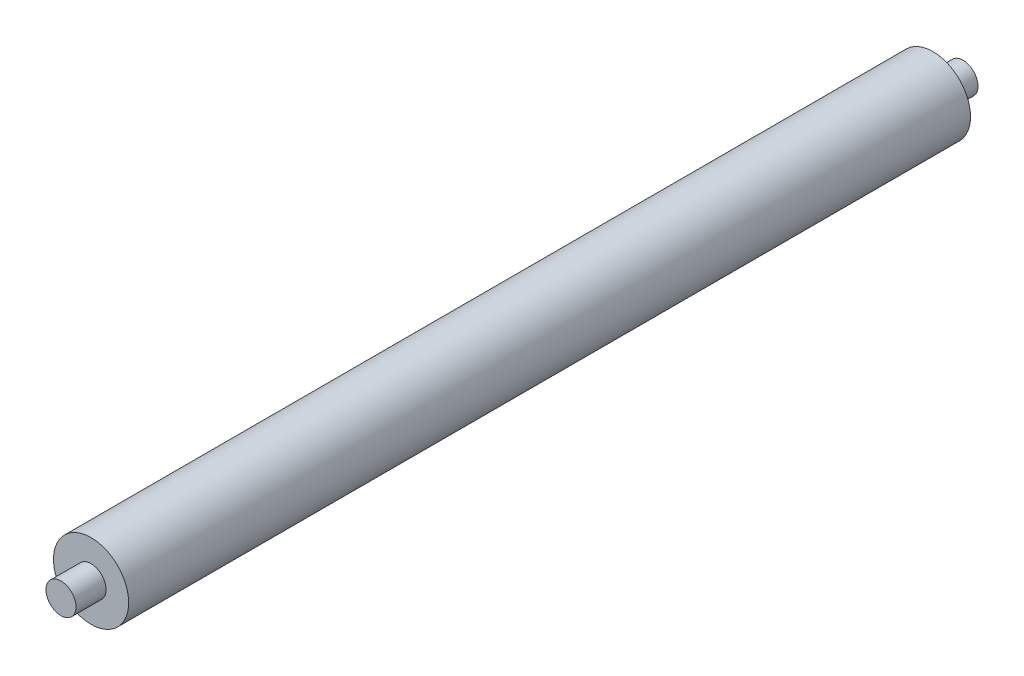
ISO-10303-21;
HEADER;
FILE_DESCRIPTION(('STEP AP214'),'2;1');
FILE_NAME('part.step','',(''),(''),'','','');
FILE_SCHEMA(('AUTOMOTIVE_DESIGN { 1 0 10303 214 1 1 1 1 }'));
ENDSEC;
DATA;
#1=APPLICATION_CONTEXT('core data for automotive mechanical design processes');
#2=APPLICATION_PROTOCOL_DEFINITION('international standard','automotive_design',2000,#1);
#3=PRODUCT_CONTEXT('',#1,'mechanical');
#4=PRODUCT('Part','Part','',(#3));
#5=PRODUCT_RELATED_PRODUCT_CATEGORY('part','',(#4));
#6=PRODUCT_DEFINITION_FORMATION('','',#4);
#7=PRODUCT_DEFINITION_CONTEXT('part definition',#1,'design');
#8=PRODUCT_DEFINITION('design','',#6,#7);
#9=PRODUCT_DEFINITION_SHAPE('','',#8);
#10=(LENGTH_UNIT() NAMED_UNIT(*) SI_UNIT(.MILLI.,.METRE.));
#11=(NAMED_UNIT(*) PLANE_ANGLE_UNIT() SI_UNIT($,.RADIAN.));
#12=(NAMED_UNIT(*) SI_UNIT($,.STERADIAN.) SOLID_ANGLE_UNIT());
#13=UNCERTAINTY_MEASURE_WITH_UNIT(LENGTH_MEASURE(1.E-05),#10,'distance_accuracy_value','');
#14=(GEOMETRIC_REPRESENTATION_CONTEXT(3) GLOBAL_UNCERTAINTY_ASSIGNED_CONTEXT((#13)) GLOBAL_UNIT_ASSIGNED_CONTEXT((#10,
#11,#12)) REPRESENTATION_CONTEXT('',''));
#15=CARTESIAN_POINT('',(0.,0.,0.));
#16=DIRECTION('',(0.,0.,1.));
#17=DIRECTION('',(1.,0.,0.));
#18=AXIS2_PLACEMENT_3D('',#15,#16,#17);
#19=CARTESIAN_POINT('',(0.,0.,280.));
#20=DIRECTION('',(0.,0.,-1.));
#21=DIRECTION('',(-1.,0.,0.));
#22=AXIS2_PLACEMENT_3D('',#19,#20,#21);
#23=CYLINDRICAL_SURFACE('',#22,12.5);
#24=CARTESIAN_POINT('',(0.,0.,280.));
#25=DIRECTION('',(0.,0.,1.));
#26=DIRECTION('',(1.,0.,0.));
#27=AXIS2_PLACEMENT_3D('',#24,#25,#26);
#28=CIRCLE('',#27,12.5);
#29=CARTESIAN_POINT('',(12.5,0.,280.));
#30=VERTEX_POINT('',#29);
#31=EDGE_CURVE('E51',#30,#30,#28,.T.);
#32=ORIENTED_EDGE('',*,*,#31,.F.);
#33=EDGE_LOOP('',(#32));
#34=FACE_BOUND('',#33,.T.);
#35=CARTESIAN_POINT('',(0.,0.,0.));
#36=DIRECTION('',(0.,0.,1.));
#37=DIRECTION('',(1.,0.,0.));
#38=AXIS2_PLACEMENT_3D('',#35,#36,#37);
#39=CIRCLE('',#38,12.5);
#40=CARTESIAN_POINT('',(12.5,0.,0.));
#41=VERTEX_POINT('',#40);
#42=EDGE_CURVE('E40',#41,#41,#39,.T.);
#43=ORIENTED_EDGE('',*,*,#42,.T.);
#44=EDGE_LOOP('',(#43));
#45=FACE_BOUND('',#44,.T.);
#46=ADVANCED_FACE('F37',(#34,#45),#23,.T.);
#47=CARTESIAN_POINT('',(0.,0.,280.));
#48=DIRECTION('',(0.,0.,1.));
#49=DIRECTION('',(1.,0.,0.));
#50=AXIS2_PLACEMENT_3D('',#47,#48,#49);
#51=PLANE('',#50);
#52=CARTESIAN_POINT('',(0.,0.,280.));
#53=DIRECTION('',(0.,0.,1.));
#54=DIRECTION('',(1.,0.,0.));
#55=AXIS2_PLACEMENT_3D('',#52,#53,#54);
#56=CIRCLE('',#55,5.);
#57=CARTESIAN_POINT('',(5.,0.,280.));
#58=VERTEX_POINT('',#57);
#59=EDGE_CURVE('E45',#58,#58,#56,.T.);
#60=ORIENTED_EDGE('',*,*,#59,.F.);
#61=EDGE_LOOP('',(#60));
#62=FACE_BOUND('',#61,.T.);
#63=ORIENTED_EDGE('',*,*,#31,.T.);
#64=EDGE_LOOP('',(#63));
#65=FACE_BOUND('',#64,.T.);
#66=ADVANCED_FACE('F71',(#62,#65),#51,.T.);
#67=CARTESIAN_POINT('',(0.,0.,0.));
#68=DIRECTION('',(0.,0.,1.));
#69=DIRECTION('',(1.,0.,0.));
#70=AXIS2_PLACEMENT_3D('',#67,#68,#69);
#71=PLANE('',#70);
#72=CARTESIAN_POINT('',(0.,0.,0.));
#73=DIRECTION('',(0.,0.,-1.));
#74=DIRECTION('',(-1.,0.,0.));
#75=AXIS2_PLACEMENT_3D('',#72,#73,#74);
#76=CIRCLE('',#75,5.);
#77=CARTESIAN_POINT('',(-5.,0.,0.));
#78=VERTEX_POINT('',#77);
#79=EDGE_CURVE('E10',#78,#78,#76,.T.);
#80=ORIENTED_EDGE('',*,*,#79,.F.);
#81=EDGE_LOOP('',(#80));
#82=FACE_BOUND('',#81,.T.);
#83=ORIENTED_EDGE('',*,*,#42,.F.);
#84=EDGE_LOOP('',(#83));
#85=FACE_BOUND('',#84,.T.);
#86=ADVANCED_FACE('F68',(#82,#85),#71,.F.);
#87=CARTESIAN_POINT('',(0.,0.,290.));
#88=DIRECTION('',(0.,0.,-1.));
#89=DIRECTION('',(-1.,0.,0.));
#90=AXIS2_PLACEMENT_3D('',#87,#88,#89);
#91=CYLINDRICAL_SURFACE('',#90,5.);
#92=CARTESIAN_POINT('',(0.,0.,290.));
#93=DIRECTION('',(0.,0.,1.));
#94=DIRECTION('',(1.,0.,0.));
#95=AXIS2_PLACEMENT_3D('',#92,#93,#94);
#96=CIRCLE('',#95,5.);
#97=CARTESIAN_POINT('',(5.,0.,290.));
#98=VERTEX_POINT('',#97);
#99=EDGE_CURVE('E56',#98,#98,#96,.T.);
#100=ORIENTED_EDGE('',*,*,#99,.F.);
#101=EDGE_LOOP('',(#100));
#102=FACE_BOUND('',#101,.T.);
#103=ORIENTED_EDGE('',*,*,#59,.T.);
#104=EDGE_LOOP('',(#103));
#105=FACE_BOUND('',#104,.T.);
#106=ADVANCED_FACE('F70',(#102,#105),#91,.T.);
#107=CARTESIAN_POINT('',(0.,0.,290.));
#108=DIRECTION('',(0.,0.,1.));
#109=DIRECTION('',(1.,0.,0.));
#110=AXIS2_PLACEMENT_3D('',#107,#108,#109);
#111=PLANE('',#110);
#112=ORIENTED_EDGE('',*,*,#99,.T.);
#113=EDGE_LOOP('',(#112));
#114=FACE_BOUND('',#113,.T.);
#115=ADVANCED_FACE('F77',(#114),#111,.T.);
#116=CARTESIAN_POINT('',(0.,0.,-10.));
#117=DIRECTION('',(0.,0.,1.));
#118=DIRECTION('',(1.,0.,0.));
#119=AXIS2_PLACEMENT_3D('',#116,#117,#118);
#120=CYLINDRICAL_SURFACE('',#119,5.);
#121=CARTESIAN_POINT('',(0.,0.,-10.));
#122=DIRECTION('',(0.,0.,-1.));
#123=DIRECTION('',(-1.,0.,0.));
#124=AXIS2_PLACEMENT_3D('',#121,#122,#123);
#125=CIRCLE('',#124,5.);
#126=CARTESIAN_POINT('',(-5.,0.,-10.));
#127=VERTEX_POINT('',#126);
#128=EDGE_CURVE('E55',#127,#127,#125,.T.);
#129=ORIENTED_EDGE('',*,*,#128,.F.);
#130=EDGE_LOOP('',(#129));
#131=FACE_BOUND('',#130,.T.);
#132=ORIENTED_EDGE('',*,*,#79,.T.);
#133=EDGE_LOOP('',(#132));
#134=FACE_BOUND('',#133,.T.);
#135=ADVANCED_FACE('F105',(#131,#134),#120,.T.);
#136=CARTESIAN_POINT('',(0.,0.,-10.));
#137=DIRECTION('',(0.,0.,-1.));
#138=DIRECTION('',(-1.,0.,0.));
#139=AXIS2_PLACEMENT_3D('',#136,#137,#138);
#140=PLANE('',#139);
#141=ORIENTED_EDGE('',*,*,#128,.T.);
#142=EDGE_LOOP('',(#141));
#143=FACE_BOUND('',#142,.T.);
#144=ADVANCED_FACE('F119',(#143),#140,.T.);
#145=CLOSED_SHELL('',(#46,#66,#86,#106,#115,#135,#144));
#146=MANIFOLD_SOLID_BREP('B2',#145);
#147=ADVANCED_BREP_SHAPE_REPRESENTATION('',(#18,#146),#14);
#148=SHAPE_DEFINITION_REPRESENTATION(#9,#147);
ENDSEC;
END-ISO-10303-21;
